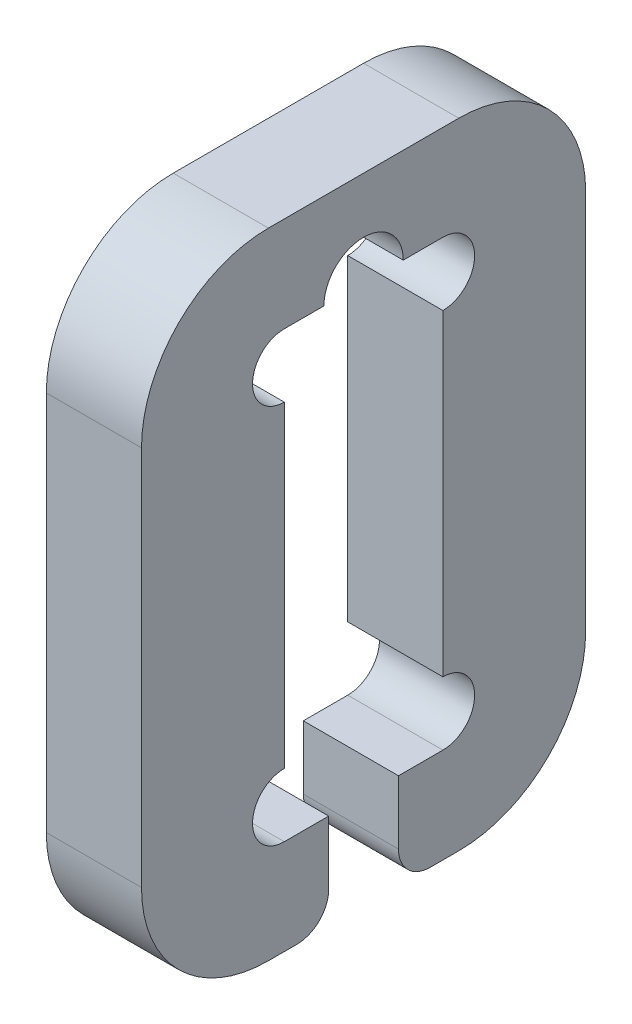
ISO-10303-21;
HEADER;
FILE_DESCRIPTION(('STEP AP214'),'2;1');
FILE_NAME('part.step','',(''),(''),'','','');
FILE_SCHEMA(('AUTOMOTIVE_DESIGN { 1 0 10303 214 1 1 1 1 }'));
ENDSEC;
DATA;
#1=APPLICATION_CONTEXT('core data for automotive mechanical design processes');
#2=APPLICATION_PROTOCOL_DEFINITION('international standard','automotive_design',2000,#1);
#3=PRODUCT_CONTEXT('',#1,'mechanical');
#4=PRODUCT('Part','Part','',(#3));
#5=PRODUCT_RELATED_PRODUCT_CATEGORY('part','',(#4));
#6=PRODUCT_DEFINITION_FORMATION('','',#4);
#7=PRODUCT_DEFINITION_CONTEXT('part definition',#1,'design');
#8=PRODUCT_DEFINITION('design','',#6,#7);
#9=PRODUCT_DEFINITION_SHAPE('','',#8);
#10=(LENGTH_UNIT() NAMED_UNIT(*) SI_UNIT(.MILLI.,.METRE.));
#11=(NAMED_UNIT(*) PLANE_ANGLE_UNIT() SI_UNIT($,.RADIAN.));
#12=(NAMED_UNIT(*) SI_UNIT($,.STERADIAN.) SOLID_ANGLE_UNIT());
#13=UNCERTAINTY_MEASURE_WITH_UNIT(LENGTH_MEASURE(1.E-05),#10,'distance_accuracy_value','');
#14=(GEOMETRIC_REPRESENTATION_CONTEXT(3) GLOBAL_UNCERTAINTY_ASSIGNED_CONTEXT((#13)) GLOBAL_UNIT_ASSIGNED_CONTEXT((#10,
#11,#12)) REPRESENTATION_CONTEXT('',''));
#15=CARTESIAN_POINT('',(0.,0.,0.));
#16=DIRECTION('',(0.,0.,1.));
#17=DIRECTION('',(1.,0.,0.));
#18=AXIS2_PLACEMENT_3D('',#15,#16,#17);
#19=CARTESIAN_POINT('',(0.,17.,-4.5));
#20=DIRECTION('',(0.,1.,0.));
#21=DIRECTION('',(0.,0.,1.));
#22=AXIS2_PLACEMENT_3D('',#19,#20,#21);
#23=PLANE('',#22);
#24=DIRECTION('',(0.,0.,1.));
#25=VECTOR('',#24,1.);
#26=CARTESIAN_POINT('',(0.,17.,-4.5));
#27=LINE('',#26,#25);
#28=CARTESIAN_POINT('',(0.,17.,-5.75));
#29=VERTEX_POINT('',#28);
#30=CARTESIAN_POINT('',(0.,17.,-4.5));
#31=VERTEX_POINT('',#30);
#32=EDGE_CURVE('E229',#29,#31,#27,.T.);
#33=ORIENTED_EDGE('',*,*,#32,.F.);
#34=DIRECTION('',(1.,0.,0.));
#35=VECTOR('',#34,1.);
#36=CARTESIAN_POINT('',(-7.,17.,-5.75));
#37=LINE('',#36,#35);
#38=CARTESIAN_POINT('',(3.,17.,-5.75));
#39=VERTEX_POINT('',#38);
#40=EDGE_CURVE('E11',#29,#39,#37,.T.);
#41=ORIENTED_EDGE('',*,*,#40,.T.);
#42=DIRECTION('',(0.,0.,1.));
#43=VECTOR('',#42,1.);
#44=CARTESIAN_POINT('',(3.,17.,-4.5));
#45=LINE('',#44,#43);
#46=CARTESIAN_POINT('',(3.,17.,-4.5));
#47=VERTEX_POINT('',#46);
#48=EDGE_CURVE('E209',#39,#47,#45,.T.);
#49=ORIENTED_EDGE('',*,*,#48,.T.);
#50=DIRECTION('',(1.,0.,0.));
#51=VECTOR('',#50,1.);
#52=CARTESIAN_POINT('',(0.,17.,-4.5));
#53=LINE('',#52,#51);
#54=EDGE_CURVE('E238',#31,#47,#53,.T.);
#55=ORIENTED_EDGE('',*,*,#54,.F.);
#56=EDGE_LOOP('',(#33,#41,#49,#55));
#57=FACE_BOUND('',#56,.T.);
#58=ADVANCED_FACE('F35',(#57),#23,.F.);
#59=CARTESIAN_POINT('',(3.,0.,0.));
#60=DIRECTION('',(0.,1.,0.));
#61=DIRECTION('',(0.,0.,1.));
#62=AXIS2_PLACEMENT_3D('',#59,#60,#61);
#63=PLANE('',#62);
#64=DIRECTION('',(0.,0.,-1.));
#65=VECTOR('',#64,1.);
#66=CARTESIAN_POINT('',(3.,0.,0.));
#67=LINE('',#66,#65);
#68=CARTESIAN_POINT('',(3.,0.,-9.1));
#69=VERTEX_POINT('',#68);
#70=CARTESIAN_POINT('',(3.,0.,-10.));
#71=VERTEX_POINT('',#70);
#72=EDGE_CURVE('E244',#69,#71,#67,.T.);
#73=ORIENTED_EDGE('',*,*,#72,.F.);
#74=DIRECTION('',(1.,0.,0.));
#75=VECTOR('',#74,1.);
#76=CARTESIAN_POINT('',(3.,0.,-9.1));
#77=LINE('',#76,#75);
#78=CARTESIAN_POINT('',(0.,0.,-9.1));
#79=VERTEX_POINT('',#78);
#80=EDGE_CURVE('E201',#69,#79,#77,.F.);
#81=ORIENTED_EDGE('',*,*,#80,.T.);
#82=DIRECTION('',(0.,0.,-1.));
#83=VECTOR('',#82,1.);
#84=CARTESIAN_POINT('',(0.,0.,0.));
#85=LINE('',#84,#83);
#86=CARTESIAN_POINT('',(0.,0.,-10.));
#87=VERTEX_POINT('',#86);
#88=EDGE_CURVE('E258',#79,#87,#85,.T.);
#89=ORIENTED_EDGE('',*,*,#88,.T.);
#90=DIRECTION('',(-1.,0.,0.));
#91=VECTOR('',#90,1.);
#92=CARTESIAN_POINT('',(3.,0.,-10.));
#93=LINE('',#92,#91);
#94=EDGE_CURVE('E305',#87,#71,#93,.F.);
#95=ORIENTED_EDGE('',*,*,#94,.T.);
#96=EDGE_LOOP('',(#73,#81,#89,#95));
#97=FACE_BOUND('',#96,.T.);
#98=ADVANCED_FACE('F331',(#97),#63,.F.);
#99=CARTESIAN_POINT('',(0.,3.,-4.5));
#100=DIRECTION('',(0.,-1.,0.));
#101=DIRECTION('',(0.,0.,-1.));
#102=AXIS2_PLACEMENT_3D('',#99,#100,#101);
#103=PLANE('',#102);
#104=DIRECTION('',(0.,0.,-1.));
#105=VECTOR('',#104,1.);
#106=CARTESIAN_POINT('',(0.,3.,-4.5));
#107=LINE('',#106,#105);
#108=CARTESIAN_POINT('',(0.,3.,-8.1));
#109=VERTEX_POINT('',#108);
#110=CARTESIAN_POINT('',(0.,3.,-9.5));
#111=VERTEX_POINT('',#110);
#112=EDGE_CURVE('E385',#109,#111,#107,.T.);
#113=ORIENTED_EDGE('',*,*,#112,.F.);
#114=DIRECTION('',(1.,0.,0.));
#115=VECTOR('',#114,1.);
#116=CARTESIAN_POINT('',(0.,3.,-8.1));
#117=LINE('',#116,#115);
#118=CARTESIAN_POINT('',(3.,3.,-8.1));
#119=VERTEX_POINT('',#118);
#120=EDGE_CURVE('E358',#109,#119,#117,.T.);
#121=ORIENTED_EDGE('',*,*,#120,.T.);
#122=DIRECTION('',(0.,0.,-1.));
#123=VECTOR('',#122,1.);
#124=CARTESIAN_POINT('',(3.,3.,-4.5));
#125=LINE('',#124,#123);
#126=CARTESIAN_POINT('',(3.,3.,-9.5));
#127=VERTEX_POINT('',#126);
#128=EDGE_CURVE('E217',#119,#127,#125,.T.);
#129=ORIENTED_EDGE('',*,*,#128,.T.);
#130=DIRECTION('',(1.,0.,0.));
#131=VECTOR('',#130,1.);
#132=CARTESIAN_POINT('',(0.,3.,-9.5));
#133=LINE('',#132,#131);
#134=EDGE_CURVE('E232',#111,#127,#133,.T.);
#135=ORIENTED_EDGE('',*,*,#134,.F.);
#136=EDGE_LOOP('',(#113,#121,#129,#135));
#137=FACE_BOUND('',#136,.T.);
#138=ADVANCED_FACE('F397',(#137),#103,.F.);
#139=CARTESIAN_POINT('',(3.,0.,0.));
#140=DIRECTION('',(0.,0.,-1.));
#141=DIRECTION('',(-1.,0.,0.));
#142=AXIS2_PLACEMENT_3D('',#139,#140,#141);
#143=PLANE('',#142);
#144=DIRECTION('',(0.,-1.,0.));
#145=VECTOR('',#144,1.);
#146=CARTESIAN_POINT('',(0.,0.,0.));
#147=LINE('',#146,#145);
#148=CARTESIAN_POINT('',(0.,16.,0.));
#149=VERTEX_POINT('',#148);
#150=CARTESIAN_POINT('',(0.,4.,0.));
#151=VERTEX_POINT('',#150);
#152=EDGE_CURVE('E231',#149,#151,#147,.T.);
#153=ORIENTED_EDGE('',*,*,#152,.T.);
#154=DIRECTION('',(-1.,0.,0.));
#155=VECTOR('',#154,1.);
#156=CARTESIAN_POINT('',(3.,4.,0.));
#157=LINE('',#156,#155);
#158=CARTESIAN_POINT('',(3.,4.,0.));
#159=VERTEX_POINT('',#158);
#160=EDGE_CURVE('E290',#151,#159,#157,.F.);
#161=ORIENTED_EDGE('',*,*,#160,.T.);
#162=DIRECTION('',(0.,-1.,0.));
#163=VECTOR('',#162,1.);
#164=CARTESIAN_POINT('',(3.,0.,0.));
#165=LINE('',#164,#163);
#166=CARTESIAN_POINT('',(3.,16.,0.));
#167=VERTEX_POINT('',#166);
#168=EDGE_CURVE('E241',#167,#159,#165,.T.);
#169=ORIENTED_EDGE('',*,*,#168,.F.);
#170=DIRECTION('',(-1.,0.,0.));
#171=VECTOR('',#170,1.);
#172=CARTESIAN_POINT('',(3.,16.,0.));
#173=LINE('',#172,#171);
#174=EDGE_CURVE('E287',#167,#149,#173,.T.);
#175=ORIENTED_EDGE('',*,*,#174,.T.);
#176=EDGE_LOOP('',(#153,#161,#169,#175));
#177=FACE_BOUND('',#176,.T.);
#178=ADVANCED_FACE('F399',(#177),#143,.F.);
#179=CARTESIAN_POINT('',(0.,0.,-4.));
#180=VERTEX_POINT('',#179);
#181=CARTESIAN_POINT('',(0.,0.,-4.9));
#182=VERTEX_POINT('',#181);
#183=EDGE_CURVE('E259',#180,#182,#85,.T.);
#184=ORIENTED_EDGE('',*,*,#183,.T.);
#185=DIRECTION('',(1.,0.,0.));
#186=VECTOR('',#185,1.);
#187=CARTESIAN_POINT('',(3.,0.,-4.9));
#188=LINE('',#187,#186);
#189=CARTESIAN_POINT('',(3.,0.,-4.9));
#190=VERTEX_POINT('',#189);
#191=EDGE_CURVE('E313',#182,#190,#188,.T.);
#192=ORIENTED_EDGE('',*,*,#191,.T.);
#193=CARTESIAN_POINT('',(3.,0.,-4.));
#194=VERTEX_POINT('',#193);
#195=EDGE_CURVE('E246',#194,#190,#67,.T.);
#196=ORIENTED_EDGE('',*,*,#195,.F.);
#197=DIRECTION('',(-1.,0.,0.));
#198=VECTOR('',#197,1.);
#199=CARTESIAN_POINT('',(3.,0.,-4.));
#200=LINE('',#199,#198);
#201=EDGE_CURVE('E275',#194,#180,#200,.T.);
#202=ORIENTED_EDGE('',*,*,#201,.T.);
#203=EDGE_LOOP('',(#184,#192,#196,#202));
#204=FACE_BOUND('',#203,.T.);
#205=ADVANCED_FACE('F406',(#204),#63,.F.);
#206=CARTESIAN_POINT('',(3.,0.,-14.));
#207=DIRECTION('',(0.,0.,1.));
#208=DIRECTION('',(1.,0.,0.));
#209=AXIS2_PLACEMENT_3D('',#206,#207,#208);
#210=PLANE('',#209);
#211=DIRECTION('',(0.,1.,0.));
#212=VECTOR('',#211,1.);
#213=CARTESIAN_POINT('',(3.,0.,-14.));
#214=LINE('',#213,#212);
#215=CARTESIAN_POINT('',(3.,4.,-14.));
#216=VERTEX_POINT('',#215);
#217=CARTESIAN_POINT('',(3.,16.,-14.));
#218=VERTEX_POINT('',#217);
#219=EDGE_CURVE('E249',#216,#218,#214,.T.);
#220=ORIENTED_EDGE('',*,*,#219,.F.);
#221=DIRECTION('',(-1.,0.,0.));
#222=VECTOR('',#221,1.);
#223=CARTESIAN_POINT('',(3.,4.,-14.));
#224=LINE('',#223,#222);
#225=CARTESIAN_POINT('',(0.,4.,-14.));
#226=VERTEX_POINT('',#225);
#227=EDGE_CURVE('E302',#216,#226,#224,.T.);
#228=ORIENTED_EDGE('',*,*,#227,.T.);
#229=DIRECTION('',(0.,1.,0.));
#230=VECTOR('',#229,1.);
#231=CARTESIAN_POINT('',(0.,0.,-14.));
#232=LINE('',#231,#230);
#233=CARTESIAN_POINT('',(0.,16.,-14.));
#234=VERTEX_POINT('',#233);
#235=EDGE_CURVE('E262',#226,#234,#232,.T.);
#236=ORIENTED_EDGE('',*,*,#235,.T.);
#237=DIRECTION('',(-1.,0.,0.));
#238=VECTOR('',#237,1.);
#239=CARTESIAN_POINT('',(3.,16.,-14.));
#240=LINE('',#239,#238);
#241=EDGE_CURVE('E300',#234,#218,#240,.F.);
#242=ORIENTED_EDGE('',*,*,#241,.T.);
#243=EDGE_LOOP('',(#220,#228,#236,#242));
#244=FACE_BOUND('',#243,.T.);
#245=ADVANCED_FACE('F437',(#244),#210,.F.);
#246=CARTESIAN_POINT('',(3.,20.,0.));
#247=DIRECTION('',(0.,-1.,0.));
#248=DIRECTION('',(0.,0.,-1.));
#249=AXIS2_PLACEMENT_3D('',#246,#247,#248);
#250=PLANE('',#249);
#251=DIRECTION('',(0.,0.,1.));
#252=VECTOR('',#251,1.);
#253=CARTESIAN_POINT('',(3.,20.,0.));
#254=LINE('',#253,#252);
#255=CARTESIAN_POINT('',(3.,20.,-10.));
#256=VERTEX_POINT('',#255);
#257=CARTESIAN_POINT('',(3.,20.,-4.));
#258=VERTEX_POINT('',#257);
#259=EDGE_CURVE('E252',#256,#258,#254,.T.);
#260=ORIENTED_EDGE('',*,*,#259,.F.);
#261=DIRECTION('',(-1.,0.,0.));
#262=VECTOR('',#261,1.);
#263=CARTESIAN_POINT('',(3.,20.,-10.));
#264=LINE('',#263,#262);
#265=CARTESIAN_POINT('',(0.,20.,-10.));
#266=VERTEX_POINT('',#265);
#267=EDGE_CURVE('E310',#256,#266,#264,.T.);
#268=ORIENTED_EDGE('',*,*,#267,.T.);
#269=DIRECTION('',(0.,0.,1.));
#270=VECTOR('',#269,1.);
#271=CARTESIAN_POINT('',(0.,20.,0.));
#272=LINE('',#271,#270);
#273=CARTESIAN_POINT('',(0.,20.,-4.));
#274=VERTEX_POINT('',#273);
#275=EDGE_CURVE('E245',#266,#274,#272,.T.);
#276=ORIENTED_EDGE('',*,*,#275,.T.);
#277=DIRECTION('',(-1.,0.,0.));
#278=VECTOR('',#277,1.);
#279=CARTESIAN_POINT('',(3.,20.,-4.));
#280=LINE('',#279,#278);
#281=EDGE_CURVE('E308',#274,#258,#280,.F.);
#282=ORIENTED_EDGE('',*,*,#281,.T.);
#283=EDGE_LOOP('',(#260,#268,#276,#282));
#284=FACE_BOUND('',#283,.T.);
#285=ADVANCED_FACE('F433',(#284),#250,.F.);
#286=CARTESIAN_POINT('',(3.,0.,0.));
#287=DIRECTION('',(-1.,0.,0.));
#288=DIRECTION('',(0.,0.,1.));
#289=AXIS2_PLACEMENT_3D('',#286,#287,#288);
#290=PLANE('',#289);
#291=ORIENTED_EDGE('',*,*,#48,.F.);
#292=CARTESIAN_POINT('',(3.,17.,-7.));
#293=DIRECTION('',(1.,0.,0.));
#294=DIRECTION('',(0.,0.,-1.));
#295=AXIS2_PLACEMENT_3D('',#292,#293,#294);
#296=CIRCLE('',#295,1.25);
#297=CARTESIAN_POINT('',(3.,17.,-8.25));
#298=VERTEX_POINT('',#297);
#299=EDGE_CURVE('E196',#298,#39,#296,.T.);
#300=ORIENTED_EDGE('',*,*,#299,.F.);
#301=CARTESIAN_POINT('',(3.,17.,-9.5));
#302=VERTEX_POINT('',#301);
#303=EDGE_CURVE('E207',#302,#298,#45,.T.);
#304=ORIENTED_EDGE('',*,*,#303,.F.);
#305=CARTESIAN_POINT('',(3.,16.,-9.5));
#306=DIRECTION('',(1.,0.,0.));
#307=DIRECTION('',(0.,0.,-1.));
#308=AXIS2_PLACEMENT_3D('',#305,#306,#307);
#309=CIRCLE('',#308,1.);
#310=CARTESIAN_POINT('',(3.,15.,-9.5));
#311=VERTEX_POINT('',#310);
#312=EDGE_CURVE('E376',#311,#302,#309,.T.);
#313=ORIENTED_EDGE('',*,*,#312,.F.);
#314=DIRECTION('',(0.,1.,0.));
#315=VECTOR('',#314,1.);
#316=CARTESIAN_POINT('',(3.,17.,-9.5));
#317=LINE('',#316,#315);
#318=CARTESIAN_POINT('',(3.,5.00000000000001,-9.5));
#319=VERTEX_POINT('',#318);
#320=EDGE_CURVE('E227',#319,#311,#317,.T.);
#321=ORIENTED_EDGE('',*,*,#320,.F.);
#322=CARTESIAN_POINT('',(3.,4.,-9.5));
#323=DIRECTION('',(1.,0.,0.));
#324=DIRECTION('',(0.,0.,-1.));
#325=AXIS2_PLACEMENT_3D('',#322,#323,#324);
#326=CIRCLE('',#325,1.);
#327=EDGE_CURVE('E357',#127,#319,#326,.T.);
#328=ORIENTED_EDGE('',*,*,#327,.F.);
#329=ORIENTED_EDGE('',*,*,#128,.F.);
#330=DIRECTION('',(0.,1.,0.));
#331=VECTOR('',#330,1.);
#332=CARTESIAN_POINT('',(3.,0.,-8.1));
#333=LINE('',#332,#331);
#334=CARTESIAN_POINT('',(3.,0.999999999999999,-8.1));
#335=VERTEX_POINT('',#334);
#336=EDGE_CURVE('E341',#335,#119,#333,.T.);
#337=ORIENTED_EDGE('',*,*,#336,.F.);
#338=CARTESIAN_POINT('',(3.,1.,-9.1));
#339=DIRECTION('',(-1.,0.,0.));
#340=DIRECTION('',(0.,0.,1.));
#341=AXIS2_PLACEMENT_3D('',#338,#339,#340);
#342=CIRCLE('',#341,1.);
#343=EDGE_CURVE('E316',#335,#69,#342,.F.);
#344=ORIENTED_EDGE('',*,*,#343,.T.);
#345=ORIENTED_EDGE('',*,*,#72,.T.);
#346=CARTESIAN_POINT('',(3.,4.,-10.));
#347=DIRECTION('',(-1.,0.,0.));
#348=DIRECTION('',(0.,0.,1.));
#349=AXIS2_PLACEMENT_3D('',#346,#347,#348);
#350=CIRCLE('',#349,4.);
#351=EDGE_CURVE('E296',#71,#216,#350,.F.);
#352=ORIENTED_EDGE('',*,*,#351,.T.);
#353=ORIENTED_EDGE('',*,*,#219,.T.);
#354=CARTESIAN_POINT('',(3.,16.,-10.));
#355=DIRECTION('',(-1.,0.,0.));
#356=DIRECTION('',(0.,0.,1.));
#357=AXIS2_PLACEMENT_3D('',#354,#355,#356);
#358=CIRCLE('',#357,4.);
#359=EDGE_CURVE('E294',#218,#256,#358,.F.);
#360=ORIENTED_EDGE('',*,*,#359,.T.);
#361=ORIENTED_EDGE('',*,*,#259,.T.);
#362=CARTESIAN_POINT('',(3.,16.,-4.));
#363=DIRECTION('',(-1.,0.,0.));
#364=DIRECTION('',(0.,0.,1.));
#365=AXIS2_PLACEMENT_3D('',#362,#363,#364);
#366=CIRCLE('',#365,4.);
#367=EDGE_CURVE('E292',#258,#167,#366,.F.);
#368=ORIENTED_EDGE('',*,*,#367,.T.);
#369=ORIENTED_EDGE('',*,*,#168,.T.);
#370=CARTESIAN_POINT('',(3.,4.,-4.));
#371=DIRECTION('',(-1.,0.,0.));
#372=DIRECTION('',(0.,0.,1.));
#373=AXIS2_PLACEMENT_3D('',#370,#371,#372);
#374=CIRCLE('',#373,4.);
#375=EDGE_CURVE('E298',#159,#194,#374,.F.);
#376=ORIENTED_EDGE('',*,*,#375,.T.);
#377=ORIENTED_EDGE('',*,*,#195,.T.);
#378=CARTESIAN_POINT('',(3.,1.,-4.9));
#379=DIRECTION('',(-1.,0.,0.));
#380=DIRECTION('',(0.,0.,1.));
#381=AXIS2_PLACEMENT_3D('',#378,#379,#380);
#382=CIRCLE('',#381,1.);
#383=CARTESIAN_POINT('',(3.,1.,-5.9));
#384=VERTEX_POINT('',#383);
#385=EDGE_CURVE('E318',#190,#384,#382,.F.);
#386=ORIENTED_EDGE('',*,*,#385,.T.);
#387=DIRECTION('',(0.,-1.,0.));
#388=VECTOR('',#387,1.);
#389=CARTESIAN_POINT('',(3.,0.,-5.9));
#390=LINE('',#389,#388);
#391=CARTESIAN_POINT('',(3.,3.,-5.9));
#392=VERTEX_POINT('',#391);
#393=EDGE_CURVE('E346',#392,#384,#390,.T.);
#394=ORIENTED_EDGE('',*,*,#393,.F.);
#395=CARTESIAN_POINT('',(3.,3.,-4.5));
#396=VERTEX_POINT('',#395);
#397=EDGE_CURVE('E224',#396,#392,#125,.T.);
#398=ORIENTED_EDGE('',*,*,#397,.F.);
#399=CARTESIAN_POINT('',(3.,4.,-4.5));
#400=DIRECTION('',(1.,0.,0.));
#401=DIRECTION('',(0.,0.,-1.));
#402=AXIS2_PLACEMENT_3D('',#399,#400,#401);
#403=CIRCLE('',#402,1.);
#404=CARTESIAN_POINT('',(3.,5.,-4.5));
#405=VERTEX_POINT('',#404);
#406=EDGE_CURVE('E367',#405,#396,#403,.T.);
#407=ORIENTED_EDGE('',*,*,#406,.F.);
#408=DIRECTION('',(0.,-1.,0.));
#409=VECTOR('',#408,1.);
#410=CARTESIAN_POINT('',(3.,17.,-4.5));
#411=LINE('',#410,#409);
#412=CARTESIAN_POINT('',(3.,15.,-4.5));
#413=VERTEX_POINT('',#412);
#414=EDGE_CURVE('E214',#413,#405,#411,.T.);
#415=ORIENTED_EDGE('',*,*,#414,.F.);
#416=CARTESIAN_POINT('',(3.,16.,-4.5));
#417=DIRECTION('',(1.,0.,0.));
#418=DIRECTION('',(0.,0.,-1.));
#419=AXIS2_PLACEMENT_3D('',#416,#417,#418);
#420=CIRCLE('',#419,1.);
#421=EDGE_CURVE('E371',#47,#413,#420,.T.);
#422=ORIENTED_EDGE('',*,*,#421,.F.);
#423=EDGE_LOOP('',(#291,#300,#304,#313,#321,#328,#329,#337,#344,#345,#352,#353,#360,#361,#368,
#369,#376,#377,#386,#394,#398,#407,#415,#422));
#424=FACE_BOUND('',#423,.T.);
#425=ADVANCED_FACE('F205',(#424),#290,.F.);
#426=CARTESIAN_POINT('',(0.,0.,0.));
#427=DIRECTION('',(-1.,0.,0.));
#428=DIRECTION('',(0.,0.,1.));
#429=AXIS2_PLACEMENT_3D('',#426,#427,#428);
#430=PLANE('',#429);
#431=CARTESIAN_POINT('',(0.,17.,-7.));
#432=DIRECTION('',(-1.,0.,0.));
#433=DIRECTION('',(0.,0.,1.));
#434=AXIS2_PLACEMENT_3D('',#431,#432,#433);
#435=CIRCLE('',#434,1.25);
#436=CARTESIAN_POINT('',(0.,17.,-8.25));
#437=VERTEX_POINT('',#436);
#438=EDGE_CURVE('E50',#29,#437,#435,.T.);
#439=ORIENTED_EDGE('',*,*,#438,.F.);
#440=ORIENTED_EDGE('',*,*,#32,.T.);
#441=CARTESIAN_POINT('',(0.,16.,-4.5));
#442=DIRECTION('',(1.,0.,0.));
#443=DIRECTION('',(0.,0.,-1.));
#444=AXIS2_PLACEMENT_3D('',#441,#442,#443);
#445=CIRCLE('',#444,1.);
#446=CARTESIAN_POINT('',(0.,15.,-4.5));
#447=VERTEX_POINT('',#446);
#448=EDGE_CURVE('E373',#31,#447,#445,.T.);
#449=ORIENTED_EDGE('',*,*,#448,.T.);
#450=DIRECTION('',(0.,-1.,0.));
#451=VECTOR('',#450,1.);
#452=CARTESIAN_POINT('',(0.,17.,-4.5));
#453=LINE('',#452,#451);
#454=CARTESIAN_POINT('',(0.,5.,-4.5));
#455=VERTEX_POINT('',#454);
#456=EDGE_CURVE('E383',#447,#455,#453,.T.);
#457=ORIENTED_EDGE('',*,*,#456,.T.);
#458=CARTESIAN_POINT('',(0.,4.,-4.5));
#459=DIRECTION('',(1.,0.,0.));
#460=DIRECTION('',(0.,0.,-1.));
#461=AXIS2_PLACEMENT_3D('',#458,#459,#460);
#462=CIRCLE('',#461,1.);
#463=CARTESIAN_POINT('',(0.,3.,-4.5));
#464=VERTEX_POINT('',#463);
#465=EDGE_CURVE('E368',#455,#464,#462,.T.);
#466=ORIENTED_EDGE('',*,*,#465,.T.);
#467=CARTESIAN_POINT('',(0.,3.,-5.9));
#468=VERTEX_POINT('',#467);
#469=EDGE_CURVE('E386',#464,#468,#107,.T.);
#470=ORIENTED_EDGE('',*,*,#469,.T.);
#471=DIRECTION('',(0.,-1.,0.));
#472=VECTOR('',#471,1.);
#473=CARTESIAN_POINT('',(0.,0.,-5.9));
#474=LINE('',#473,#472);
#475=CARTESIAN_POINT('',(0.,1.,-5.9));
#476=VERTEX_POINT('',#475);
#477=EDGE_CURVE('E352',#468,#476,#474,.T.);
#478=ORIENTED_EDGE('',*,*,#477,.T.);
#479=CARTESIAN_POINT('',(0.,1.,-4.9));
#480=DIRECTION('',(-1.,0.,0.));
#481=DIRECTION('',(0.,0.,1.));
#482=AXIS2_PLACEMENT_3D('',#479,#480,#481);
#483=CIRCLE('',#482,1.);
#484=EDGE_CURVE('E323',#476,#182,#483,.T.);
#485=ORIENTED_EDGE('',*,*,#484,.T.);
#486=ORIENTED_EDGE('',*,*,#183,.F.);
#487=CARTESIAN_POINT('',(0.,4.,-4.));
#488=DIRECTION('',(-1.,0.,0.));
#489=DIRECTION('',(0.,0.,1.));
#490=AXIS2_PLACEMENT_3D('',#487,#488,#489);
#491=CIRCLE('',#490,4.);
#492=EDGE_CURVE('E285',#180,#151,#491,.T.);
#493=ORIENTED_EDGE('',*,*,#492,.T.);
#494=ORIENTED_EDGE('',*,*,#152,.F.);
#495=CARTESIAN_POINT('',(0.,16.,-4.));
#496=DIRECTION('',(-1.,0.,0.));
#497=DIRECTION('',(0.,0.,1.));
#498=AXIS2_PLACEMENT_3D('',#495,#496,#497);
#499=CIRCLE('',#498,4.);
#500=EDGE_CURVE('E278',#149,#274,#499,.T.);
#501=ORIENTED_EDGE('',*,*,#500,.T.);
#502=ORIENTED_EDGE('',*,*,#275,.F.);
#503=CARTESIAN_POINT('',(0.,16.,-10.));
#504=DIRECTION('',(-1.,0.,0.));
#505=DIRECTION('',(0.,0.,1.));
#506=AXIS2_PLACEMENT_3D('',#503,#504,#505);
#507=CIRCLE('',#506,4.);
#508=EDGE_CURVE('E280',#266,#234,#507,.T.);
#509=ORIENTED_EDGE('',*,*,#508,.T.);
#510=ORIENTED_EDGE('',*,*,#235,.F.);
#511=CARTESIAN_POINT('',(0.,4.,-10.));
#512=DIRECTION('',(-1.,0.,0.));
#513=DIRECTION('',(0.,0.,1.));
#514=AXIS2_PLACEMENT_3D('',#511,#512,#513);
#515=CIRCLE('',#514,4.);
#516=EDGE_CURVE('E282',#226,#87,#515,.T.);
#517=ORIENTED_EDGE('',*,*,#516,.T.);
#518=ORIENTED_EDGE('',*,*,#88,.F.);
#519=CARTESIAN_POINT('',(0.,1.,-9.1));
#520=DIRECTION('',(-1.,0.,0.));
#521=DIRECTION('',(0.,0.,1.));
#522=AXIS2_PLACEMENT_3D('',#519,#520,#521);
#523=CIRCLE('',#522,1.);
#524=CARTESIAN_POINT('',(0.,0.999999999999999,-8.1));
#525=VERTEX_POINT('',#524);
#526=EDGE_CURVE('E58',#79,#525,#523,.T.);
#527=ORIENTED_EDGE('',*,*,#526,.T.);
#528=DIRECTION('',(0.,1.,0.));
#529=VECTOR('',#528,1.);
#530=CARTESIAN_POINT('',(0.,0.,-8.1));
#531=LINE('',#530,#529);
#532=EDGE_CURVE('E343',#525,#109,#531,.T.);
#533=ORIENTED_EDGE('',*,*,#532,.T.);
#534=ORIENTED_EDGE('',*,*,#112,.T.);
#535=CARTESIAN_POINT('',(0.,4.,-9.5));
#536=DIRECTION('',(1.,0.,0.));
#537=DIRECTION('',(0.,0.,-1.));
#538=AXIS2_PLACEMENT_3D('',#535,#536,#537);
#539=CIRCLE('',#538,1.);
#540=CARTESIAN_POINT('',(0.,5.00000000000001,-9.5));
#541=VERTEX_POINT('',#540);
#542=EDGE_CURVE('E360',#111,#541,#539,.T.);
#543=ORIENTED_EDGE('',*,*,#542,.T.);
#544=DIRECTION('',(0.,1.,0.));
#545=VECTOR('',#544,1.);
#546=CARTESIAN_POINT('',(0.,17.,-9.5));
#547=LINE('',#546,#545);
#548=CARTESIAN_POINT('',(0.,15.,-9.5));
#549=VERTEX_POINT('',#548);
#550=EDGE_CURVE('E221',#541,#549,#547,.T.);
#551=ORIENTED_EDGE('',*,*,#550,.T.);
#552=CARTESIAN_POINT('',(0.,16.,-9.5));
#553=DIRECTION('',(1.,0.,0.));
#554=DIRECTION('',(0.,0.,-1.));
#555=AXIS2_PLACEMENT_3D('',#552,#553,#554);
#556=CIRCLE('',#555,1.);
#557=CARTESIAN_POINT('',(0.,17.,-9.5));
#558=VERTEX_POINT('',#557);
#559=EDGE_CURVE('E219',#549,#558,#556,.T.);
#560=ORIENTED_EDGE('',*,*,#559,.T.);
#561=EDGE_CURVE('E381',#558,#437,#27,.T.);
#562=ORIENTED_EDGE('',*,*,#561,.T.);
#563=EDGE_LOOP('',(#439,#440,#449,#457,#466,#470,#478,#485,#486,#493,#494,#501,#502,#509,#510,
#517,#518,#527,#533,#534,#543,#551,#560,#562));
#564=FACE_BOUND('',#563,.T.);
#565=ADVANCED_FACE('F333',(#564),#430,.T.);
#566=ORIENTED_EDGE('',*,*,#303,.T.);
#567=DIRECTION('',(1.,0.,0.));
#568=VECTOR('',#567,1.);
#569=CARTESIAN_POINT('',(-7.,17.,-8.25));
#570=LINE('',#569,#568);
#571=EDGE_CURVE('E43',#298,#437,#570,.F.);
#572=ORIENTED_EDGE('',*,*,#571,.T.);
#573=ORIENTED_EDGE('',*,*,#561,.F.);
#574=DIRECTION('',(1.,0.,0.));
#575=VECTOR('',#574,1.);
#576=CARTESIAN_POINT('',(0.,17.,-9.5));
#577=LINE('',#576,#575);
#578=EDGE_CURVE('E213',#558,#302,#577,.T.);
#579=ORIENTED_EDGE('',*,*,#578,.T.);
#580=EDGE_LOOP('',(#566,#572,#573,#579));
#581=FACE_BOUND('',#580,.T.);
#582=ADVANCED_FACE('F212',(#581),#23,.F.);
#583=CARTESIAN_POINT('',(0.,17.,-9.5));
#584=DIRECTION('',(0.,0.,-1.));
#585=DIRECTION('',(0.,1.,0.));
#586=AXIS2_PLACEMENT_3D('',#583,#584,#585);
#587=PLANE('',#586);
#588=ORIENTED_EDGE('',*,*,#550,.F.);
#589=DIRECTION('',(1.,0.,0.));
#590=VECTOR('',#589,1.);
#591=CARTESIAN_POINT('',(0.,5.00000000000001,-9.5));
#592=LINE('',#591,#590);
#593=EDGE_CURVE('E363',#541,#319,#592,.T.);
#594=ORIENTED_EDGE('',*,*,#593,.T.);
#595=ORIENTED_EDGE('',*,*,#320,.T.);
#596=DIRECTION('',(1.,0.,0.));
#597=VECTOR('',#596,1.);
#598=CARTESIAN_POINT('',(0.,15.,-9.5));
#599=LINE('',#598,#597);
#600=EDGE_CURVE('E255',#311,#549,#599,.F.);
#601=ORIENTED_EDGE('',*,*,#600,.T.);
#602=EDGE_LOOP('',(#588,#594,#595,#601));
#603=FACE_BOUND('',#602,.T.);
#604=ADVANCED_FACE('F414',(#603),#587,.F.);
#605=ORIENTED_EDGE('',*,*,#397,.T.);
#606=DIRECTION('',(1.,0.,0.));
#607=VECTOR('',#606,1.);
#608=CARTESIAN_POINT('',(0.,3.,-5.9));
#609=LINE('',#608,#607);
#610=EDGE_CURVE('E355',#468,#392,#609,.T.);
#611=ORIENTED_EDGE('',*,*,#610,.F.);
#612=ORIENTED_EDGE('',*,*,#469,.F.);
#613=DIRECTION('',(1.,0.,0.));
#614=VECTOR('',#613,1.);
#615=CARTESIAN_POINT('',(0.,3.,-4.5));
#616=LINE('',#615,#614);
#617=EDGE_CURVE('E235',#464,#396,#616,.T.);
#618=ORIENTED_EDGE('',*,*,#617,.T.);
#619=EDGE_LOOP('',(#605,#611,#612,#618));
#620=FACE_BOUND('',#619,.T.);
#621=ADVANCED_FACE('F401',(#620),#103,.F.);
#622=CARTESIAN_POINT('',(0.,17.,-4.5));
#623=DIRECTION('',(0.,0.,1.));
#624=DIRECTION('',(0.,-1.,0.));
#625=AXIS2_PLACEMENT_3D('',#622,#623,#624);
#626=PLANE('',#625);
#627=ORIENTED_EDGE('',*,*,#414,.T.);
#628=DIRECTION('',(1.,0.,0.));
#629=VECTOR('',#628,1.);
#630=CARTESIAN_POINT('',(0.,5.,-4.5));
#631=LINE('',#630,#629);
#632=EDGE_CURVE('E272',#405,#455,#631,.F.);
#633=ORIENTED_EDGE('',*,*,#632,.T.);
#634=ORIENTED_EDGE('',*,*,#456,.F.);
#635=DIRECTION('',(1.,0.,0.));
#636=VECTOR('',#635,1.);
#637=CARTESIAN_POINT('',(0.,15.,-4.5));
#638=LINE('',#637,#636);
#639=EDGE_CURVE('E269',#447,#413,#638,.T.);
#640=ORIENTED_EDGE('',*,*,#639,.T.);
#641=EDGE_LOOP('',(#627,#633,#634,#640));
#642=FACE_BOUND('',#641,.T.);
#643=ADVANCED_FACE('F413',(#642),#626,.F.);
#644=CARTESIAN_POINT('',(0.,16.,-9.5));
#645=DIRECTION('',(1.,0.,0.));
#646=DIRECTION('',(0.,0.,-1.));
#647=AXIS2_PLACEMENT_3D('',#644,#645,#646);
#648=CYLINDRICAL_SURFACE('',#647,1.);
#649=ORIENTED_EDGE('',*,*,#559,.F.);
#650=ORIENTED_EDGE('',*,*,#600,.F.);
#651=ORIENTED_EDGE('',*,*,#312,.T.);
#652=ORIENTED_EDGE('',*,*,#578,.F.);
#653=EDGE_LOOP('',(#649,#650,#651,#652));
#654=FACE_BOUND('',#653,.T.);
#655=ADVANCED_FACE('F503',(#654),#648,.F.);
#656=CARTESIAN_POINT('',(0.,16.,-4.5));
#657=DIRECTION('',(1.,0.,0.));
#658=DIRECTION('',(0.,0.,-1.));
#659=AXIS2_PLACEMENT_3D('',#656,#657,#658);
#660=CYLINDRICAL_SURFACE('',#659,1.);
#661=ORIENTED_EDGE('',*,*,#448,.F.);
#662=ORIENTED_EDGE('',*,*,#54,.T.);
#663=ORIENTED_EDGE('',*,*,#421,.T.);
#664=ORIENTED_EDGE('',*,*,#639,.F.);
#665=EDGE_LOOP('',(#661,#662,#663,#664));
#666=FACE_BOUND('',#665,.T.);
#667=ADVANCED_FACE('F498',(#666),#660,.F.);
#668=CARTESIAN_POINT('',(0.,4.,-4.5));
#669=DIRECTION('',(1.,0.,0.));
#670=DIRECTION('',(0.,0.,-1.));
#671=AXIS2_PLACEMENT_3D('',#668,#669,#670);
#672=CYLINDRICAL_SURFACE('',#671,1.);
#673=ORIENTED_EDGE('',*,*,#465,.F.);
#674=ORIENTED_EDGE('',*,*,#632,.F.);
#675=ORIENTED_EDGE('',*,*,#406,.T.);
#676=ORIENTED_EDGE('',*,*,#617,.F.);
#677=EDGE_LOOP('',(#673,#674,#675,#676));
#678=FACE_BOUND('',#677,.T.);
#679=ADVANCED_FACE('F511',(#678),#672,.F.);
#680=CARTESIAN_POINT('',(0.,4.,-9.5));
#681=DIRECTION('',(1.,0.,0.));
#682=DIRECTION('',(0.,0.,-1.));
#683=AXIS2_PLACEMENT_3D('',#680,#681,#682);
#684=CYLINDRICAL_SURFACE('',#683,1.);
#685=ORIENTED_EDGE('',*,*,#542,.F.);
#686=ORIENTED_EDGE('',*,*,#134,.T.);
#687=ORIENTED_EDGE('',*,*,#327,.T.);
#688=ORIENTED_EDGE('',*,*,#593,.F.);
#689=EDGE_LOOP('',(#685,#686,#687,#688));
#690=FACE_BOUND('',#689,.T.);
#691=ADVANCED_FACE('F396',(#690),#684,.F.);
#692=CARTESIAN_POINT('',(0.,0.,-5.9));
#693=DIRECTION('',(0.,0.,1.));
#694=DIRECTION('',(0.,-1.,0.));
#695=AXIS2_PLACEMENT_3D('',#692,#693,#694);
#696=PLANE('',#695);
#697=ORIENTED_EDGE('',*,*,#393,.T.);
#698=DIRECTION('',(1.,0.,0.));
#699=VECTOR('',#698,1.);
#700=CARTESIAN_POINT('',(0.,1.,-5.9));
#701=LINE('',#700,#699);
#702=EDGE_CURVE('E320',#384,#476,#701,.F.);
#703=ORIENTED_EDGE('',*,*,#702,.T.);
#704=ORIENTED_EDGE('',*,*,#477,.F.);
#705=ORIENTED_EDGE('',*,*,#610,.T.);
#706=EDGE_LOOP('',(#697,#703,#704,#705));
#707=FACE_BOUND('',#706,.T.);
#708=ADVANCED_FACE('F489',(#707),#696,.F.);
#709=CARTESIAN_POINT('',(0.,0.,-8.1));
#710=DIRECTION('',(0.,0.,-1.));
#711=DIRECTION('',(0.,1.,0.));
#712=AXIS2_PLACEMENT_3D('',#709,#710,#711);
#713=PLANE('',#712);
#714=ORIENTED_EDGE('',*,*,#532,.F.);
#715=DIRECTION('',(1.,0.,0.));
#716=VECTOR('',#715,1.);
#717=CARTESIAN_POINT('',(0.,0.999999999999999,-8.1));
#718=LINE('',#717,#716);
#719=EDGE_CURVE('E325',#525,#335,#718,.T.);
#720=ORIENTED_EDGE('',*,*,#719,.T.);
#721=ORIENTED_EDGE('',*,*,#336,.T.);
#722=ORIENTED_EDGE('',*,*,#120,.F.);
#723=EDGE_LOOP('',(#714,#720,#721,#722));
#724=FACE_BOUND('',#723,.T.);
#725=ADVANCED_FACE('F339',(#724),#713,.F.);
#726=CARTESIAN_POINT('',(3.,4.,-4.));
#727=DIRECTION('',(-1.,0.,0.));
#728=DIRECTION('',(0.,0.,1.));
#729=AXIS2_PLACEMENT_3D('',#726,#727,#728);
#730=CYLINDRICAL_SURFACE('',#729,4.);
#731=ORIENTED_EDGE('',*,*,#375,.F.);
#732=ORIENTED_EDGE('',*,*,#160,.F.);
#733=ORIENTED_EDGE('',*,*,#492,.F.);
#734=ORIENTED_EDGE('',*,*,#201,.F.);
#735=EDGE_LOOP('',(#731,#732,#733,#734));
#736=FACE_BOUND('',#735,.T.);
#737=ADVANCED_FACE('F444',(#736),#730,.T.);
#738=CARTESIAN_POINT('',(3.,4.,-10.));
#739=DIRECTION('',(-1.,0.,0.));
#740=DIRECTION('',(0.,0.,1.));
#741=AXIS2_PLACEMENT_3D('',#738,#739,#740);
#742=CYLINDRICAL_SURFACE('',#741,4.);
#743=ORIENTED_EDGE('',*,*,#351,.F.);
#744=ORIENTED_EDGE('',*,*,#94,.F.);
#745=ORIENTED_EDGE('',*,*,#516,.F.);
#746=ORIENTED_EDGE('',*,*,#227,.F.);
#747=EDGE_LOOP('',(#743,#744,#745,#746));
#748=FACE_BOUND('',#747,.T.);
#749=ADVANCED_FACE('F447',(#748),#742,.T.);
#750=CARTESIAN_POINT('',(3.,16.,-10.));
#751=DIRECTION('',(-1.,0.,0.));
#752=DIRECTION('',(0.,0.,1.));
#753=AXIS2_PLACEMENT_3D('',#750,#751,#752);
#754=CYLINDRICAL_SURFACE('',#753,4.);
#755=ORIENTED_EDGE('',*,*,#359,.F.);
#756=ORIENTED_EDGE('',*,*,#241,.F.);
#757=ORIENTED_EDGE('',*,*,#508,.F.);
#758=ORIENTED_EDGE('',*,*,#267,.F.);
#759=EDGE_LOOP('',(#755,#756,#757,#758));
#760=FACE_BOUND('',#759,.T.);
#761=ADVANCED_FACE('F451',(#760),#754,.T.);
#762=CARTESIAN_POINT('',(3.,16.,-4.));
#763=DIRECTION('',(-1.,0.,0.));
#764=DIRECTION('',(0.,0.,1.));
#765=AXIS2_PLACEMENT_3D('',#762,#763,#764);
#766=CYLINDRICAL_SURFACE('',#765,4.);
#767=ORIENTED_EDGE('',*,*,#367,.F.);
#768=ORIENTED_EDGE('',*,*,#281,.F.);
#769=ORIENTED_EDGE('',*,*,#500,.F.);
#770=ORIENTED_EDGE('',*,*,#174,.F.);
#771=EDGE_LOOP('',(#767,#768,#769,#770));
#772=FACE_BOUND('',#771,.T.);
#773=ADVANCED_FACE('F455',(#772),#766,.T.);
#774=CARTESIAN_POINT('',(3.,1.,-4.9));
#775=DIRECTION('',(1.,0.,0.));
#776=DIRECTION('',(0.,0.,-1.));
#777=AXIS2_PLACEMENT_3D('',#774,#775,#776);
#778=CYLINDRICAL_SURFACE('',#777,1.);
#779=ORIENTED_EDGE('',*,*,#484,.F.);
#780=ORIENTED_EDGE('',*,*,#702,.F.);
#781=ORIENTED_EDGE('',*,*,#385,.F.);
#782=ORIENTED_EDGE('',*,*,#191,.F.);
#783=EDGE_LOOP('',(#779,#780,#781,#782));
#784=FACE_BOUND('',#783,.T.);
#785=ADVANCED_FACE('F458',(#784),#778,.T.);
#786=CARTESIAN_POINT('',(0.,1.,-9.1));
#787=DIRECTION('',(1.,0.,0.));
#788=DIRECTION('',(0.,0.,-1.));
#789=AXIS2_PLACEMENT_3D('',#786,#787,#788);
#790=CYLINDRICAL_SURFACE('',#789,1.);
#791=ORIENTED_EDGE('',*,*,#526,.F.);
#792=ORIENTED_EDGE('',*,*,#80,.F.);
#793=ORIENTED_EDGE('',*,*,#343,.F.);
#794=ORIENTED_EDGE('',*,*,#719,.F.);
#795=EDGE_LOOP('',(#791,#792,#793,#794));
#796=FACE_BOUND('',#795,.T.);
#797=ADVANCED_FACE('F37',(#796),#790,.T.);
#798=CARTESIAN_POINT('',(-7.,17.,-7.));
#799=DIRECTION('',(1.,0.,0.));
#800=DIRECTION('',(0.,0.,-1.));
#801=AXIS2_PLACEMENT_3D('',#798,#799,#800);
#802=CYLINDRICAL_SURFACE('',#801,1.25);
#803=ORIENTED_EDGE('',*,*,#438,.T.);
#804=ORIENTED_EDGE('',*,*,#571,.F.);
#805=ORIENTED_EDGE('',*,*,#299,.T.);
#806=ORIENTED_EDGE('',*,*,#40,.F.);
#807=EDGE_LOOP('',(#803,#804,#805,#806));
#808=FACE_BOUND('',#807,.T.);
#809=ADVANCED_FACE('F195',(#808),#802,.F.);
#810=CLOSED_SHELL('',(#58,#98,#138,#178,#205,#245,#285,#425,#565,#582,#604,#621,#643,#655,#667,
#679,#691,#708,#725,#737,#749,#761,#773,#785,#797,#809));
#811=MANIFOLD_SOLID_BREP('B2',#810);
#812=ADVANCED_BREP_SHAPE_REPRESENTATION('',(#18,#811),#14);
#813=SHAPE_DEFINITION_REPRESENTATION(#9,#812);
ENDSEC;
END-ISO-10303-21;
